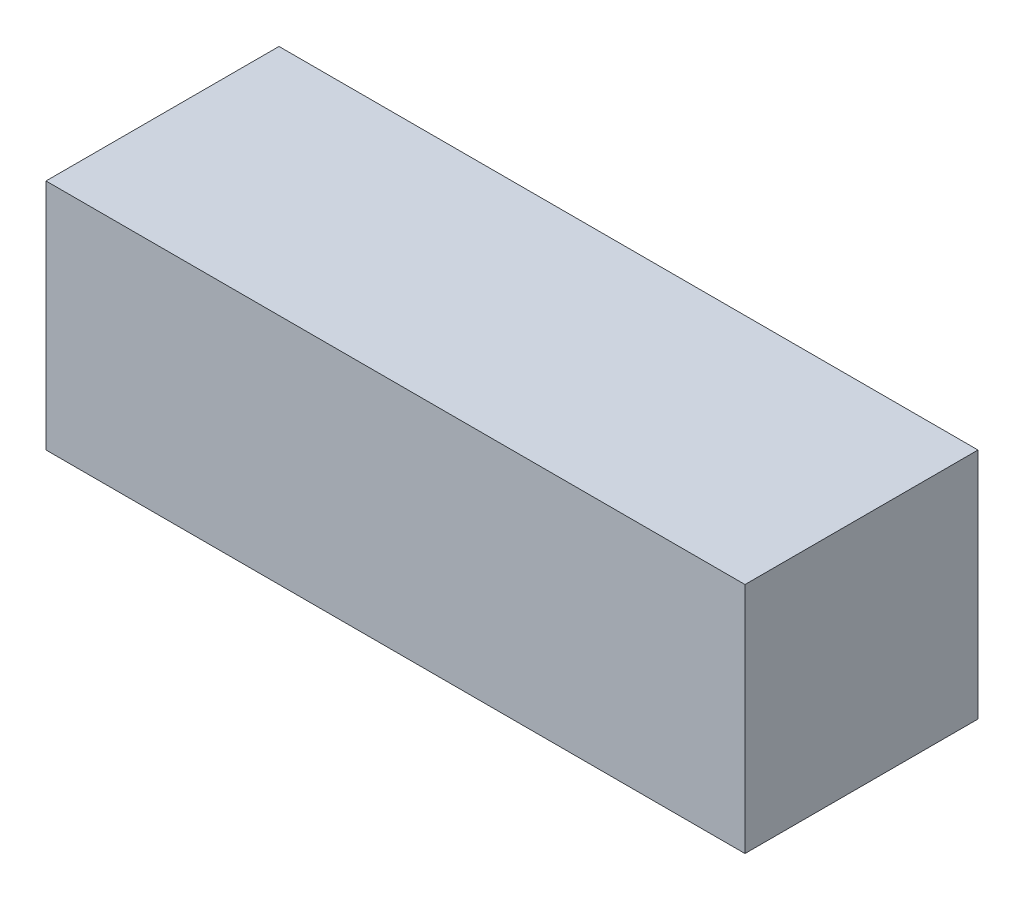
ISO-10303-21;
HEADER;
FILE_DESCRIPTION(('STEP AP214'),'2;1');
FILE_NAME('part.step','',(''),(''),'','','');
FILE_SCHEMA(('AUTOMOTIVE_DESIGN { 1 0 10303 214 1 1 1 1 }'));
ENDSEC;
DATA;
#1=APPLICATION_CONTEXT('core data for automotive mechanical design processes');
#2=APPLICATION_PROTOCOL_DEFINITION('international standard','automotive_design',2000,#1);
#3=PRODUCT_CONTEXT('',#1,'mechanical');
#4=PRODUCT('Part','Part','',(#3));
#5=PRODUCT_RELATED_PRODUCT_CATEGORY('part','',(#4));
#6=PRODUCT_DEFINITION_FORMATION('','',#4);
#7=PRODUCT_DEFINITION_CONTEXT('part definition',#1,'design');
#8=PRODUCT_DEFINITION('design','',#6,#7);
#9=PRODUCT_DEFINITION_SHAPE('','',#8);
#10=(LENGTH_UNIT() NAMED_UNIT(*) SI_UNIT(.MILLI.,.METRE.));
#11=(NAMED_UNIT(*) PLANE_ANGLE_UNIT() SI_UNIT($,.RADIAN.));
#12=(NAMED_UNIT(*) SI_UNIT($,.STERADIAN.) SOLID_ANGLE_UNIT());
#13=UNCERTAINTY_MEASURE_WITH_UNIT(LENGTH_MEASURE(1.E-05),#10,'distance_accuracy_value','');
#14=(GEOMETRIC_REPRESENTATION_CONTEXT(3) GLOBAL_UNCERTAINTY_ASSIGNED_CONTEXT((#13)) GLOBAL_UNIT_ASSIGNED_CONTEXT((#10,
#11,#12)) REPRESENTATION_CONTEXT('',''));
#15=CARTESIAN_POINT('',(0.,0.,0.));
#16=DIRECTION('',(0.,0.,1.));
#17=DIRECTION('',(1.,0.,0.));
#18=AXIS2_PLACEMENT_3D('',#15,#16,#17);
#19=CARTESIAN_POINT('',(6.,-2.,-2.));
#20=DIRECTION('',(0.,0.,1.));
#21=DIRECTION('',(1.,0.,0.));
#22=AXIS2_PLACEMENT_3D('',#19,#20,#21);
#23=PLANE('',#22);
#24=DIRECTION('',(0.,1.,0.));
#25=VECTOR('',#24,1.);
#26=CARTESIAN_POINT('',(-6.,-2.,-2.));
#27=LINE('',#26,#25);
#28=CARTESIAN_POINT('',(-6.,-2.,-2.));
#29=VERTEX_POINT('',#28);
#30=CARTESIAN_POINT('',(-6.,2.,-2.));
#31=VERTEX_POINT('',#30);
#32=EDGE_CURVE('E104',#29,#31,#27,.T.);
#33=ORIENTED_EDGE('',*,*,#32,.T.);
#34=DIRECTION('',(-1.,0.,0.));
#35=VECTOR('',#34,1.);
#36=CARTESIAN_POINT('',(6.,2.,-2.));
#37=LINE('',#36,#35);
#38=CARTESIAN_POINT('',(6.,2.,-2.));
#39=VERTEX_POINT('',#38);
#40=EDGE_CURVE('E11',#39,#31,#37,.T.);
#41=ORIENTED_EDGE('',*,*,#40,.F.);
#42=DIRECTION('',(0.,1.,0.));
#43=VECTOR('',#42,1.);
#44=CARTESIAN_POINT('',(6.,-2.,-2.));
#45=LINE('',#44,#43);
#46=CARTESIAN_POINT('',(6.,-2.,-2.));
#47=VERTEX_POINT('',#46);
#48=EDGE_CURVE('E92',#47,#39,#45,.T.);
#49=ORIENTED_EDGE('',*,*,#48,.F.);
#50=DIRECTION('',(-1.,0.,0.));
#51=VECTOR('',#50,1.);
#52=CARTESIAN_POINT('',(6.,-2.,-2.));
#53=LINE('',#52,#51);
#54=EDGE_CURVE('E100',#47,#29,#53,.T.);
#55=ORIENTED_EDGE('',*,*,#54,.T.);
#56=EDGE_LOOP('',(#33,#41,#49,#55));
#57=FACE_BOUND('',#56,.T.);
#58=ADVANCED_FACE('F41',(#57),#23,.F.);
#59=CARTESIAN_POINT('',(6.,2.,2.));
#60=DIRECTION('',(0.,-1.,0.));
#61=DIRECTION('',(0.,0.,-1.));
#62=AXIS2_PLACEMENT_3D('',#59,#60,#61);
#63=PLANE('',#62);
#64=DIRECTION('',(0.,0.,1.));
#65=VECTOR('',#64,1.);
#66=CARTESIAN_POINT('',(-6.,2.,2.));
#67=LINE('',#66,#65);
#68=CARTESIAN_POINT('',(-6.,2.,2.));
#69=VERTEX_POINT('',#68);
#70=EDGE_CURVE('E96',#31,#69,#67,.T.);
#71=ORIENTED_EDGE('',*,*,#70,.T.);
#72=DIRECTION('',(-1.,0.,0.));
#73=VECTOR('',#72,1.);
#74=CARTESIAN_POINT('',(6.,2.,2.));
#75=LINE('',#74,#73);
#76=CARTESIAN_POINT('',(6.,2.,2.));
#77=VERTEX_POINT('',#76);
#78=EDGE_CURVE('E49',#77,#69,#75,.T.);
#79=ORIENTED_EDGE('',*,*,#78,.F.);
#80=DIRECTION('',(0.,0.,1.));
#81=VECTOR('',#80,1.);
#82=CARTESIAN_POINT('',(6.,2.,2.));
#83=LINE('',#82,#81);
#84=EDGE_CURVE('E87',#39,#77,#83,.T.);
#85=ORIENTED_EDGE('',*,*,#84,.F.);
#86=ORIENTED_EDGE('',*,*,#40,.T.);
#87=EDGE_LOOP('',(#71,#79,#85,#86));
#88=FACE_BOUND('',#87,.T.);
#89=ADVANCED_FACE('F95',(#88),#63,.F.);
#90=CARTESIAN_POINT('',(6.,-2.,2.));
#91=DIRECTION('',(0.,0.,-1.));
#92=DIRECTION('',(-1.,0.,0.));
#93=AXIS2_PLACEMENT_3D('',#90,#91,#92);
#94=PLANE('',#93);
#95=DIRECTION('',(0.,-1.,0.));
#96=VECTOR('',#95,1.);
#97=CARTESIAN_POINT('',(-6.,-2.,2.));
#98=LINE('',#97,#96);
#99=CARTESIAN_POINT('',(-6.,-2.,2.));
#100=VERTEX_POINT('',#99);
#101=EDGE_CURVE('E74',#69,#100,#98,.T.);
#102=ORIENTED_EDGE('',*,*,#101,.T.);
#103=DIRECTION('',(-1.,0.,0.));
#104=VECTOR('',#103,1.);
#105=CARTESIAN_POINT('',(6.,-2.,2.));
#106=LINE('',#105,#104);
#107=CARTESIAN_POINT('',(6.,-2.,2.));
#108=VERTEX_POINT('',#107);
#109=EDGE_CURVE('E97',#108,#100,#106,.T.);
#110=ORIENTED_EDGE('',*,*,#109,.F.);
#111=DIRECTION('',(0.,-1.,0.));
#112=VECTOR('',#111,1.);
#113=CARTESIAN_POINT('',(6.,-2.,2.));
#114=LINE('',#113,#112);
#115=EDGE_CURVE('E90',#77,#108,#114,.T.);
#116=ORIENTED_EDGE('',*,*,#115,.F.);
#117=ORIENTED_EDGE('',*,*,#78,.T.);
#118=EDGE_LOOP('',(#102,#110,#116,#117));
#119=FACE_BOUND('',#118,.T.);
#120=ADVANCED_FACE('F98',(#119),#94,.F.);
#121=CARTESIAN_POINT('',(6.,-2.,2.));
#122=DIRECTION('',(0.,1.,0.));
#123=DIRECTION('',(0.,0.,1.));
#124=AXIS2_PLACEMENT_3D('',#121,#122,#123);
#125=PLANE('',#124);
#126=DIRECTION('',(0.,0.,-1.));
#127=VECTOR('',#126,1.);
#128=CARTESIAN_POINT('',(-6.,-2.,2.));
#129=LINE('',#128,#127);
#130=EDGE_CURVE('E80',#100,#29,#129,.T.);
#131=ORIENTED_EDGE('',*,*,#130,.T.);
#132=ORIENTED_EDGE('',*,*,#54,.F.);
#133=DIRECTION('',(0.,0.,-1.));
#134=VECTOR('',#133,1.);
#135=CARTESIAN_POINT('',(6.,-2.,2.));
#136=LINE('',#135,#134);
#137=EDGE_CURVE('E57',#108,#47,#136,.T.);
#138=ORIENTED_EDGE('',*,*,#137,.F.);
#139=ORIENTED_EDGE('',*,*,#109,.T.);
#140=EDGE_LOOP('',(#131,#132,#138,#139));
#141=FACE_BOUND('',#140,.T.);
#142=ADVANCED_FACE('F111',(#141),#125,.F.);
#143=CARTESIAN_POINT('',(6.,0.,0.));
#144=DIRECTION('',(-1.,0.,0.));
#145=DIRECTION('',(0.,0.,1.));
#146=AXIS2_PLACEMENT_3D('',#143,#144,#145);
#147=PLANE('',#146);
#148=ORIENTED_EDGE('',*,*,#48,.T.);
#149=ORIENTED_EDGE('',*,*,#84,.T.);
#150=ORIENTED_EDGE('',*,*,#115,.T.);
#151=ORIENTED_EDGE('',*,*,#137,.T.);
#152=EDGE_LOOP('',(#148,#149,#150,#151));
#153=FACE_BOUND('',#152,.T.);
#154=ADVANCED_FACE('F88',(#153),#147,.F.);
#155=CARTESIAN_POINT('',(-6.,0.,0.));
#156=DIRECTION('',(-1.,0.,0.));
#157=DIRECTION('',(0.,0.,1.));
#158=AXIS2_PLACEMENT_3D('',#155,#156,#157);
#159=PLANE('',#158);
#160=ORIENTED_EDGE('',*,*,#32,.F.);
#161=ORIENTED_EDGE('',*,*,#130,.F.);
#162=ORIENTED_EDGE('',*,*,#101,.F.);
#163=ORIENTED_EDGE('',*,*,#70,.F.);
#164=EDGE_LOOP('',(#160,#161,#162,#163));
#165=FACE_BOUND('',#164,.T.);
#166=ADVANCED_FACE('F114',(#165),#159,.T.);
#167=CLOSED_SHELL('',(#58,#89,#120,#142,#154,#166));
#168=MANIFOLD_SOLID_BREP('B2',#167);
#169=ADVANCED_BREP_SHAPE_REPRESENTATION('',(#18,#168),#14);
#170=SHAPE_DEFINITION_REPRESENTATION(#9,#169);
ENDSEC;
END-ISO-10303-21;
